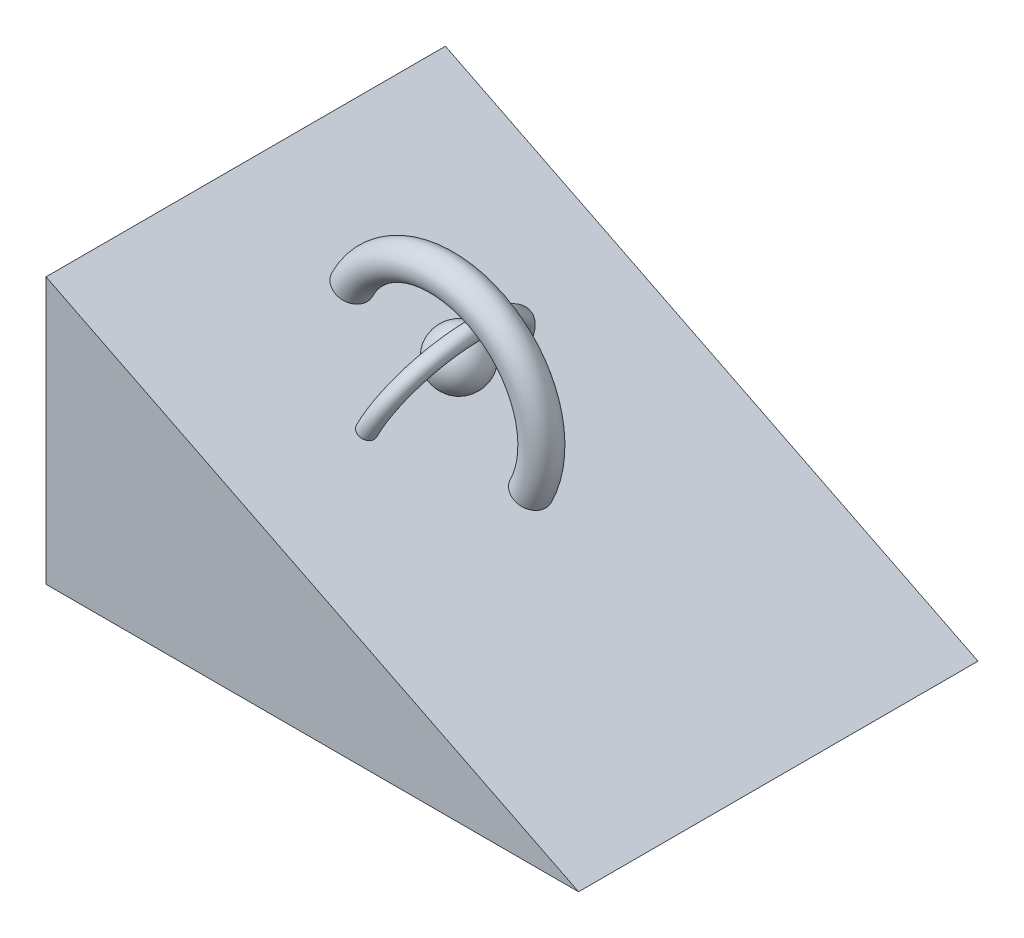
ISO-10303-21;
HEADER;
FILE_DESCRIPTION(('STEP AP214'),'2;1');
FILE_NAME('part.step','',(''),(''),'','','');
FILE_SCHEMA(('AUTOMOTIVE_DESIGN { 1 0 10303 214 1 1 1 1 }'));
ENDSEC;
DATA;
#1=APPLICATION_CONTEXT('core data for automotive mechanical design processes');
#2=APPLICATION_PROTOCOL_DEFINITION('international standard','automotive_design',2000,#1);
#3=PRODUCT_CONTEXT('',#1,'mechanical');
#4=PRODUCT('Part','Part','',(#3));
#5=PRODUCT_RELATED_PRODUCT_CATEGORY('part','',(#4));
#6=PRODUCT_DEFINITION_FORMATION('','',#4);
#7=PRODUCT_DEFINITION_CONTEXT('part definition',#1,'design');
#8=PRODUCT_DEFINITION('design','',#6,#7);
#9=PRODUCT_DEFINITION_SHAPE('','',#8);
#10=(LENGTH_UNIT() NAMED_UNIT(*) SI_UNIT(.MILLI.,.METRE.));
#11=(NAMED_UNIT(*) PLANE_ANGLE_UNIT() SI_UNIT($,.RADIAN.));
#12=(NAMED_UNIT(*) SI_UNIT($,.STERADIAN.) SOLID_ANGLE_UNIT());
#13=UNCERTAINTY_MEASURE_WITH_UNIT(LENGTH_MEASURE(1.E-05),#10,'distance_accuracy_value','');
#14=(GEOMETRIC_REPRESENTATION_CONTEXT(3) GLOBAL_UNCERTAINTY_ASSIGNED_CONTEXT((#13)) GLOBAL_UNIT_ASSIGNED_CONTEXT((#10,
#11,#12)) REPRESENTATION_CONTEXT('',''));
#15=CARTESIAN_POINT('',(0.,0.,0.));
#16=DIRECTION('',(0.,0.,1.));
#17=DIRECTION('',(1.,0.,0.));
#18=AXIS2_PLACEMENT_3D('',#15,#16,#17);
#19=CARTESIAN_POINT('',(37.3588379885484,32.1205810057258,0.));
#20=DIRECTION('',(0.447213595499957,0.894427190999916,0.));
#21=DIRECTION('',(-0.894427190999916,0.447213595499957,0.));
#22=AXIS2_PLACEMENT_3D('',#19,#20,#21);
#23=CONICAL_SURFACE('',#22,0.,0.785398163397441);
#24=CARTESIAN_POINT('',(39.0223580229841,35.4476210745971,0.));
#25=DIRECTION('',(0.447213595499957,0.894427190999916,0.));
#26=DIRECTION('',(-0.894427190999916,0.447213595499957,0.));
#27=AXIS2_PLACEMENT_3D('',#24,#25,#26);
#28=CIRCLE('',#27,3.71974387893084);
#29=CARTESIAN_POINT('',(35.6953179541128,37.1111411090327,0.));
#30=VERTEX_POINT('',#29);
#31=EDGE_CURVE('E12',#30,#30,#28,.T.);
#32=ORIENTED_EDGE('',*,*,#31,.F.);
#33=EDGE_LOOP('',(#32));
#34=FACE_BOUND('',#33,.T.);
#35=CARTESIAN_POINT('',(37.3588379885484,32.1205810057258,0.));
#36=VERTEX_POINT('',#35);
#37=VERTEX_LOOP('',#36);
#38=FACE_BOUND('',#37,.T.);
#39=ADVANCED_FACE('F53',(#34,#38),#23,.T.);
#40=CARTESIAN_POINT('',(40.6858780574197,38.7746611434683,0.));
#41=DIRECTION('',(0.447213595499957,0.894427190999916,0.));
#42=DIRECTION('',(0.,0.,-1.));
#43=AXIS2_PLACEMENT_3D('',#40,#41,#42);
#44=SPHERICAL_SURFACE('',#43,5.26051224213828);
#45=ORIENTED_EDGE('',*,*,#31,.T.);
#46=EDGE_LOOP('',(#45));
#47=FACE_BOUND('',#46,.T.);
#48=ADVANCED_FACE('F61',(#47),#44,.T.);
#49=CLOSED_SHELL('',(#39,#48));
#50=MANIFOLD_SOLID_BREP('B2',#49);
#51=CARTESIAN_POINT('',(101.6,0.,-38.1));
#52=DIRECTION('',(0.,-1.,0.));
#53=DIRECTION('',(0.,0.,-1.));
#54=AXIS2_PLACEMENT_3D('',#51,#52,#53);
#55=PLANE('',#54);
#56=DIRECTION('',(1.,0.,0.));
#57=VECTOR('',#56,1.);
#58=CARTESIAN_POINT('',(101.6,0.,38.1));
#59=LINE('',#58,#57);
#60=CARTESIAN_POINT('',(0.,0.,38.1));
#61=VERTEX_POINT('',#60);
#62=CARTESIAN_POINT('',(101.6,0.,38.1));
#63=VERTEX_POINT('',#62);
#64=EDGE_CURVE('E140',#61,#63,#59,.T.);
#65=ORIENTED_EDGE('',*,*,#64,.F.);
#66=DIRECTION('',(0.,0.,1.));
#67=VECTOR('',#66,1.);
#68=CARTESIAN_POINT('',(0.,0.,-38.1));
#69=LINE('',#68,#67);
#70=CARTESIAN_POINT('',(0.,0.,-38.1));
#71=VERTEX_POINT('',#70);
#72=EDGE_CURVE('E101',#71,#61,#69,.T.);
#73=ORIENTED_EDGE('',*,*,#72,.F.);
#74=DIRECTION('',(1.,0.,0.));
#75=VECTOR('',#74,1.);
#76=CARTESIAN_POINT('',(101.6,0.,-38.1));
#77=LINE('',#76,#75);
#78=CARTESIAN_POINT('',(101.6,0.,-38.1));
#79=VERTEX_POINT('',#78);
#80=EDGE_CURVE('E132',#71,#79,#77,.T.);
#81=ORIENTED_EDGE('',*,*,#80,.T.);
#82=DIRECTION('',(0.,0.,1.));
#83=VECTOR('',#82,1.);
#84=CARTESIAN_POINT('',(101.6,0.,-38.1));
#85=LINE('',#84,#83);
#86=EDGE_CURVE('E121',#79,#63,#85,.T.);
#87=ORIENTED_EDGE('',*,*,#86,.T.);
#88=EDGE_LOOP('',(#65,#73,#81,#87));
#89=FACE_BOUND('',#88,.T.);
#90=ADVANCED_FACE('F85',(#89),#55,.T.);
#91=CARTESIAN_POINT('',(0.,0.,-38.1));
#92=DIRECTION('',(-1.,0.,0.));
#93=DIRECTION('',(0.,0.,1.));
#94=AXIS2_PLACEMENT_3D('',#91,#92,#93);
#95=PLANE('',#94);
#96=DIRECTION('',(0.,-1.,0.));
#97=VECTOR('',#96,1.);
#98=CARTESIAN_POINT('',(0.,0.,38.1));
#99=LINE('',#98,#97);
#100=CARTESIAN_POINT('',(0.,50.8,38.1));
#101=VERTEX_POINT('',#100);
#102=EDGE_CURVE('E134',#101,#61,#99,.T.);
#103=ORIENTED_EDGE('',*,*,#102,.F.);
#104=DIRECTION('',(0.,0.,1.));
#105=VECTOR('',#104,1.);
#106=CARTESIAN_POINT('',(0.,50.8,-38.1));
#107=LINE('',#106,#105);
#108=CARTESIAN_POINT('',(0.,50.8,-38.1));
#109=VERTEX_POINT('',#108);
#110=EDGE_CURVE('E115',#109,#101,#107,.T.);
#111=ORIENTED_EDGE('',*,*,#110,.F.);
#112=DIRECTION('',(0.,-1.,0.));
#113=VECTOR('',#112,1.);
#114=CARTESIAN_POINT('',(0.,0.,-38.1));
#115=LINE('',#114,#113);
#116=EDGE_CURVE('E128',#109,#71,#115,.T.);
#117=ORIENTED_EDGE('',*,*,#116,.T.);
#118=ORIENTED_EDGE('',*,*,#72,.T.);
#119=EDGE_LOOP('',(#103,#111,#117,#118));
#120=FACE_BOUND('',#119,.T.);
#121=ADVANCED_FACE('F157',(#120),#95,.T.);
#122=CARTESIAN_POINT('',(0.,50.8,-38.1));
#123=DIRECTION('',(0.447213595499958,0.894427190999916,0.));
#124=DIRECTION('',(-0.894427190999916,0.447213595499958,0.));
#125=AXIS2_PLACEMENT_3D('',#122,#123,#124);
#126=PLANE('',#125);
#127=CARTESIAN_POINT('',(37.3588379885484,32.1205810057258,-14.2748));
#128=DIRECTION('',(0.447213595499958,0.894427190999916,0.));
#129=DIRECTION('',(-0.894427190999916,0.447213595499958,0.));
#130=AXIS2_PLACEMENT_3D('',#127,#128,#129);
#131=CIRCLE('',#130,1.5875);
#132=CARTESIAN_POINT('',(37.3588379885484,32.1205810057258,-15.8623));
#133=VERTEX_POINT('',#132);
#134=EDGE_CURVE('E51',#133,#133,#131,.T.);
#135=ORIENTED_EDGE('',*,*,#134,.F.);
#136=EDGE_LOOP('',(#135));
#137=FACE_BOUND('',#136,.T.);
#138=CARTESIAN_POINT('',(37.3588379885484,32.1205810057258,14.2748));
#139=DIRECTION('',(0.447213595499958,0.894427190999916,0.));
#140=DIRECTION('',(-0.894427190999916,0.447213595499958,0.));
#141=AXIS2_PLACEMENT_3D('',#138,#139,#140);
#142=CIRCLE('',#141,1.5875);
#143=CARTESIAN_POINT('',(37.3588379885484,32.1205810057258,15.8623));
#144=VERTEX_POINT('',#143);
#145=EDGE_CURVE('E93',#144,#144,#142,.T.);
#146=ORIENTED_EDGE('',*,*,#145,.F.);
#147=EDGE_LOOP('',(#146));
#148=FACE_BOUND('',#147,.T.);
#149=CARTESIAN_POINT('',(54.3976759770968,23.6011620114516,0.));
#150=DIRECTION('',(0.447213595499958,0.894427190999916,0.));
#151=DIRECTION('',(-0.894427190999916,0.447213595499958,0.));
#152=AXIS2_PLACEMENT_3D('',#149,#150,#151);
#153=CIRCLE('',#152,3.175);
#154=CARTESIAN_POINT('',(57.2374823085215,22.1812588457392,0.));
#155=VERTEX_POINT('',#154);
#156=EDGE_CURVE('E148',#155,#155,#153,.T.);
#157=ORIENTED_EDGE('',*,*,#156,.F.);
#158=EDGE_LOOP('',(#157));
#159=FACE_BOUND('',#158,.T.);
#160=CARTESIAN_POINT('',(20.32,40.64,0.));
#161=DIRECTION('',(0.447213595499958,0.894427190999916,0.));
#162=DIRECTION('',(-0.894427190999916,0.447213595499958,0.));
#163=AXIS2_PLACEMENT_3D('',#160,#161,#162);
#164=CIRCLE('',#163,3.175);
#165=CARTESIAN_POINT('',(17.4801936685753,42.0599031657124,0.));
#166=VERTEX_POINT('',#165);
#167=EDGE_CURVE('E144',#166,#166,#164,.T.);
#168=ORIENTED_EDGE('',*,*,#167,.F.);
#169=EDGE_LOOP('',(#168));
#170=FACE_BOUND('',#169,.T.);
#171=DIRECTION('',(-0.894427190999916,0.447213595499958,0.));
#172=VECTOR('',#171,1.);
#173=CARTESIAN_POINT('',(0.,50.8,38.1));
#174=LINE('',#173,#172);
#175=EDGE_CURVE('E126',#63,#101,#174,.T.);
#176=ORIENTED_EDGE('',*,*,#175,.F.);
#177=ORIENTED_EDGE('',*,*,#86,.F.);
#178=DIRECTION('',(-0.894427190999916,0.447213595499958,0.));
#179=VECTOR('',#178,1.);
#180=CARTESIAN_POINT('',(0.,50.8,-38.1));
#181=LINE('',#180,#179);
#182=EDGE_CURVE('E124',#79,#109,#181,.T.);
#183=ORIENTED_EDGE('',*,*,#182,.T.);
#184=ORIENTED_EDGE('',*,*,#110,.T.);
#185=EDGE_LOOP('',(#176,#177,#183,#184));
#186=FACE_BOUND('',#185,.T.);
#187=ADVANCED_FACE('F123',(#137,#148,#159,#170,#186),#126,.T.);
#188=CARTESIAN_POINT('',(0.,0.,-38.1));
#189=DIRECTION('',(0.,0.,-1.));
#190=DIRECTION('',(-1.,0.,0.));
#191=AXIS2_PLACEMENT_3D('',#188,#189,#190);
#192=PLANE('',#191);
#193=ORIENTED_EDGE('',*,*,#80,.F.);
#194=ORIENTED_EDGE('',*,*,#116,.F.);
#195=ORIENTED_EDGE('',*,*,#182,.F.);
#196=EDGE_LOOP('',(#193,#194,#195));
#197=FACE_BOUND('',#196,.T.);
#198=ADVANCED_FACE('F131',(#197),#192,.T.);
#199=CARTESIAN_POINT('',(0.,0.,38.1));
#200=DIRECTION('',(0.,0.,-1.));
#201=DIRECTION('',(-1.,0.,0.));
#202=AXIS2_PLACEMENT_3D('',#199,#200,#201);
#203=PLANE('',#202);
#204=ORIENTED_EDGE('',*,*,#64,.T.);
#205=ORIENTED_EDGE('',*,*,#175,.T.);
#206=ORIENTED_EDGE('',*,*,#102,.T.);
#207=EDGE_LOOP('',(#204,#205,#206));
#208=FACE_BOUND('',#207,.T.);
#209=ADVANCED_FACE('F165',(#208),#203,.F.);
#210=CARTESIAN_POINT('',(37.3588379885484,32.1205810057258,0.));
#211=DIRECTION('',(0.,0.,-1.));
#212=DIRECTION('',(-1.,0.,0.));
#213=AXIS2_PLACEMENT_3D('',#210,#211,#212);
#214=TOROIDAL_SURFACE('',#213,19.05,3.175);
#215=CARTESIAN_POINT('',(37.3588379885484,32.1205810057258,0.));
#216=DIRECTION('',(0.,0.,-1.));
#217=DIRECTION('',(-1.,0.,0.));
#218=AXIS2_PLACEMENT_3D('',#215,#216,#217);
#219=CIRCLE('',#218,22.225);
#220=EDGE_CURVE('',#166,#155,#219,.T.);
#221=ORIENTED_EDGE('',*,*,#167,.T.);
#222=ORIENTED_EDGE('',*,*,#156,.T.);
#223=ORIENTED_EDGE('',*,*,#220,.T.);
#224=ORIENTED_EDGE('',*,*,#220,.F.);
#225=EDGE_LOOP('',(#221,#223,#222,#224));
#226=FACE_BOUND('',#225,.T.);
#227=ADVANCED_FACE('F163',(#226),#214,.T.);
#228=CARTESIAN_POINT('',(37.3588379885484,32.1205810057258,0.));
#229=DIRECTION('',(-0.894427190999916,0.447213595499958,0.));
#230=DIRECTION('',(-0.447213595499958,-0.894427190999916,0.));
#231=AXIS2_PLACEMENT_3D('',#228,#229,#230);
#232=TOROIDAL_SURFACE('',#231,14.2748,1.5875);
#233=CARTESIAN_POINT('',(37.3588379885484,32.1205810057258,0.));
#234=DIRECTION('',(-0.894427190999916,0.447213595499958,0.));
#235=DIRECTION('',(-0.447213595499958,-0.894427190999916,0.));
#236=AXIS2_PLACEMENT_3D('',#233,#234,#235);
#237=CIRCLE('',#236,15.8623);
#238=EDGE_CURVE('',#144,#133,#237,.T.);
#239=ORIENTED_EDGE('',*,*,#145,.T.);
#240=ORIENTED_EDGE('',*,*,#134,.T.);
#241=ORIENTED_EDGE('',*,*,#238,.T.);
#242=ORIENTED_EDGE('',*,*,#238,.F.);
#243=EDGE_LOOP('',(#239,#241,#240,#242));
#244=FACE_BOUND('',#243,.T.);
#245=ADVANCED_FACE('F153',(#244),#232,.T.);
#246=CLOSED_SHELL('',(#90,#121,#187,#198,#209,#227,#245));
#247=MANIFOLD_SOLID_BREP('B6',#246);
#248=ADVANCED_BREP_SHAPE_REPRESENTATION('',(#18,#50,#247),#14);
#249=SHAPE_DEFINITION_REPRESENTATION(#9,#248);
ENDSEC;
END-ISO-10303-21;
